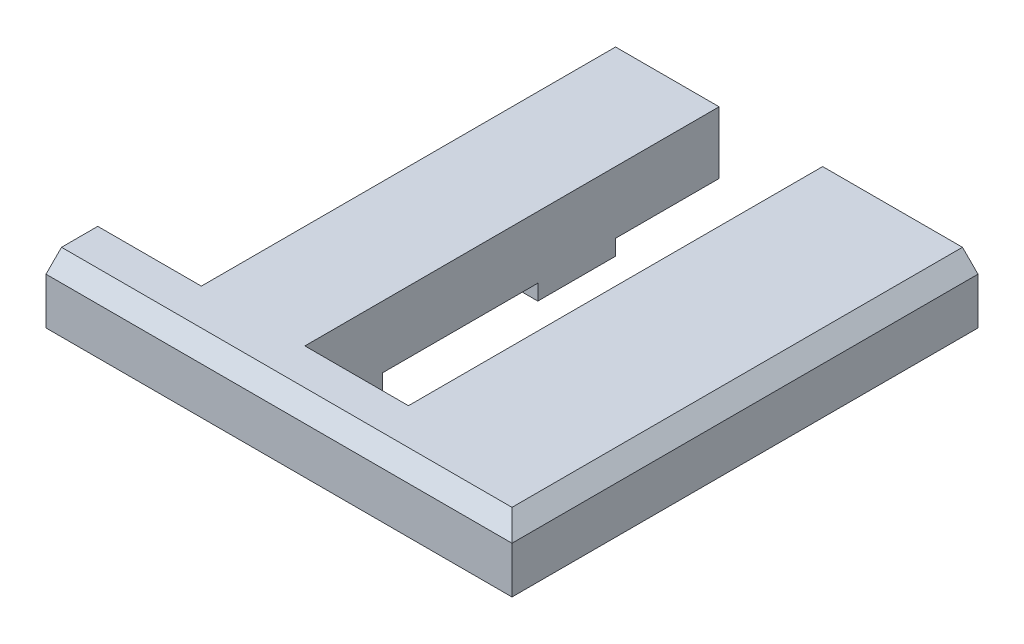
ISO-10303-21;
HEADER;
FILE_DESCRIPTION(('STEP AP214'),'2;1');
FILE_NAME('part.step','',(''),(''),'','','');
FILE_SCHEMA(('AUTOMOTIVE_DESIGN { 1 0 10303 214 1 1 1 1 }'));
ENDSEC;
DATA;
#1=APPLICATION_CONTEXT('core data for automotive mechanical design processes');
#2=APPLICATION_PROTOCOL_DEFINITION('international standard','automotive_design',2000,#1);
#3=PRODUCT_CONTEXT('',#1,'mechanical');
#4=PRODUCT('Part','Part','',(#3));
#5=PRODUCT_RELATED_PRODUCT_CATEGORY('part','',(#4));
#6=PRODUCT_DEFINITION_FORMATION('','',#4);
#7=PRODUCT_DEFINITION_CONTEXT('part definition',#1,'design');
#8=PRODUCT_DEFINITION('design','',#6,#7);
#9=PRODUCT_DEFINITION_SHAPE('','',#8);
#10=(LENGTH_UNIT() NAMED_UNIT(*) SI_UNIT(.MILLI.,.METRE.));
#11=(NAMED_UNIT(*) PLANE_ANGLE_UNIT() SI_UNIT($,.RADIAN.));
#12=(NAMED_UNIT(*) SI_UNIT($,.STERADIAN.) SOLID_ANGLE_UNIT());
#13=UNCERTAINTY_MEASURE_WITH_UNIT(LENGTH_MEASURE(1.E-05),#10,'distance_accuracy_value','');
#14=(GEOMETRIC_REPRESENTATION_CONTEXT(3) GLOBAL_UNCERTAINTY_ASSIGNED_CONTEXT((#13)) GLOBAL_UNIT_ASSIGNED_CONTEXT((#10,
#11,#12)) REPRESENTATION_CONTEXT('',''));
#15=CARTESIAN_POINT('',(0.,0.,0.));
#16=DIRECTION('',(0.,0.,1.));
#17=DIRECTION('',(1.,0.,0.));
#18=AXIS2_PLACEMENT_3D('',#15,#16,#17);
#19=CARTESIAN_POINT('',(0.,0.,0.));
#20=DIRECTION('',(0.,1.,0.));
#21=DIRECTION('',(0.,0.,1.));
#22=AXIS2_PLACEMENT_3D('',#19,#20,#21);
#23=PLANE('',#22);
#24=DIRECTION('',(0.,0.,-1.));
#25=VECTOR('',#24,1.);
#26=CARTESIAN_POINT('',(-127.,0.,0.));
#27=LINE('',#26,#25);
#28=CARTESIAN_POINT('',(-127.,0.,-139.671028997046));
#29=VERTEX_POINT('',#28);
#30=CARTESIAN_POINT('',(-127.,0.,-177.742057994092));
#31=VERTEX_POINT('',#30);
#32=EDGE_CURVE('E347',#29,#31,#27,.T.);
#33=ORIENTED_EDGE('',*,*,#32,.F.);
#34=DIRECTION('',(1.,0.,0.));
#35=VECTOR('',#34,1.);
#36=CARTESIAN_POINT('',(-177.8,0.,-139.671028997046));
#37=LINE('',#36,#35);
#38=CARTESIAN_POINT('',(-177.8,0.,-139.671028997046));
#39=VERTEX_POINT('',#38);
#40=EDGE_CURVE('E244',#39,#29,#37,.T.);
#41=ORIENTED_EDGE('',*,*,#40,.F.);
#42=DIRECTION('',(0.,0.,-1.));
#43=VECTOR('',#42,1.);
#44=CARTESIAN_POINT('',(-177.8,0.,0.));
#45=LINE('',#44,#43);
#46=CARTESIAN_POINT('',(-177.8,0.,-177.742057994092));
#47=VERTEX_POINT('',#46);
#48=EDGE_CURVE('E352',#39,#47,#45,.T.);
#49=ORIENTED_EDGE('',*,*,#48,.T.);
#50=DIRECTION('',(1.,0.,0.));
#51=VECTOR('',#50,1.);
#52=CARTESIAN_POINT('',(0.,0.,-177.742057994092));
#53=LINE('',#52,#51);
#54=EDGE_CURVE('E385',#47,#31,#53,.T.);
#55=ORIENTED_EDGE('',*,*,#54,.T.);
#56=EDGE_LOOP('',(#33,#41,#49,#55));
#57=FACE_BOUND('',#56,.T.);
#58=ADVANCED_FACE('F39',(#57),#23,.F.);
#59=CARTESIAN_POINT('',(0.,38.1,-228.6));
#60=DIRECTION('',(0.,0.,1.));
#61=DIRECTION('',(1.,0.,0.));
#62=AXIS2_PLACEMENT_3D('',#59,#60,#61);
#63=PLANE('',#62);
#64=CARTESIAN_POINT('',(-12.6848921789995,19.05,-228.6));
#65=DIRECTION('',(0.,0.,-1.));
#66=DIRECTION('',(-1.,0.,0.));
#67=AXIS2_PLACEMENT_3D('',#64,#65,#66);
#68=CIRCLE('',#67,9.525);
#69=CARTESIAN_POINT('',(-22.2098921789995,19.05,-228.6));
#70=VERTEX_POINT('',#69);
#71=EDGE_CURVE('E308',#70,#70,#68,.T.);
#72=ORIENTED_EDGE('',*,*,#71,.F.);
#73=EDGE_LOOP('',(#72));
#74=FACE_BOUND('',#73,.T.);
#75=DIRECTION('',(-1.,0.,0.));
#76=VECTOR('',#75,1.);
#77=CARTESIAN_POINT('',(0.,38.1,-228.6));
#78=LINE('',#77,#76);
#79=CARTESIAN_POINT('',(-7.61999999999996,38.1,-228.6));
#80=VERTEX_POINT('',#79);
#81=CARTESIAN_POINT('',(-76.2,38.1,-228.6));
#82=VERTEX_POINT('',#81);
#83=EDGE_CURVE('E321',#80,#82,#78,.T.);
#84=ORIENTED_EDGE('',*,*,#83,.F.);
#85=DIRECTION('',(0.707106781186545,-0.70710678118655,0.));
#86=VECTOR('',#85,1.);
#87=CARTESIAN_POINT('',(-7.61999999999999,38.1,-228.6));
#88=LINE('',#87,#86);
#89=CARTESIAN_POINT('',(0.,30.48,-228.6));
#90=VERTEX_POINT('',#89);
#91=EDGE_CURVE('E411',#80,#90,#88,.T.);
#92=ORIENTED_EDGE('',*,*,#91,.T.);
#93=DIRECTION('',(0.,-1.,0.));
#94=VECTOR('',#93,1.);
#95=CARTESIAN_POINT('',(0.,38.1,-228.6));
#96=LINE('',#95,#94);
#97=CARTESIAN_POINT('',(0.,7.62000000000002,-228.6));
#98=VERTEX_POINT('',#97);
#99=EDGE_CURVE('E339',#90,#98,#96,.T.);
#100=ORIENTED_EDGE('',*,*,#99,.T.);
#101=DIRECTION('',(0.707106781186549,0.707106781186546,0.));
#102=VECTOR('',#101,1.);
#103=CARTESIAN_POINT('',(0.,7.61999999999999,-228.6));
#104=LINE('',#103,#102);
#105=CARTESIAN_POINT('',(-7.62000000000004,0.,-228.6));
#106=VERTEX_POINT('',#105);
#107=EDGE_CURVE('E409',#98,#106,#104,.F.);
#108=ORIENTED_EDGE('',*,*,#107,.T.);
#109=DIRECTION('',(-1.,0.,0.));
#110=VECTOR('',#109,1.);
#111=CARTESIAN_POINT('',(0.,0.,-228.6));
#112=LINE('',#111,#110);
#113=CARTESIAN_POINT('',(-50.8,0.,-228.6));
#114=VERTEX_POINT('',#113);
#115=EDGE_CURVE('E318',#106,#114,#112,.T.);
#116=ORIENTED_EDGE('',*,*,#115,.T.);
#117=DIRECTION('',(0.,1.,0.));
#118=VECTOR('',#117,1.);
#119=CARTESIAN_POINT('',(-50.8,38.1,-228.6));
#120=LINE('',#119,#118);
#121=CARTESIAN_POINT('',(-50.8,7.61999999999987,-228.6));
#122=VERTEX_POINT('',#121);
#123=EDGE_CURVE('E287',#114,#122,#120,.T.);
#124=ORIENTED_EDGE('',*,*,#123,.T.);
#125=DIRECTION('',(-1.,0.,0.));
#126=VECTOR('',#125,1.);
#127=CARTESIAN_POINT('',(0.,7.61999999999986,-228.6));
#128=LINE('',#127,#126);
#129=CARTESIAN_POINT('',(-76.2,7.61999999999988,-228.6));
#130=VERTEX_POINT('',#129);
#131=EDGE_CURVE('E305',#122,#130,#128,.T.);
#132=ORIENTED_EDGE('',*,*,#131,.T.);
#133=DIRECTION('',(0.,-1.,0.));
#134=VECTOR('',#133,1.);
#135=CARTESIAN_POINT('',(-76.2,38.1,-228.6));
#136=LINE('',#135,#134);
#137=EDGE_CURVE('E379',#82,#130,#136,.T.);
#138=ORIENTED_EDGE('',*,*,#137,.F.);
#139=EDGE_LOOP('',(#84,#92,#100,#108,#116,#124,#132,#138));
#140=FACE_BOUND('',#139,.T.);
#141=ADVANCED_FACE('F430',(#74,#140),#63,.F.);
#142=CARTESIAN_POINT('',(-76.2,38.1,0.));
#143=DIRECTION('',(-1.,0.,0.));
#144=DIRECTION('',(0.,0.,1.));
#145=AXIS2_PLACEMENT_3D('',#142,#143,#144);
#146=PLANE('',#145);
#147=DIRECTION('',(0.,-1.,0.));
#148=VECTOR('',#147,1.);
#149=CARTESIAN_POINT('',(-76.2,38.1,-139.671028997046));
#150=LINE('',#149,#148);
#151=CARTESIAN_POINT('',(-76.2,7.62000000000001,-139.671028997046));
#152=VERTEX_POINT('',#151);
#153=CARTESIAN_POINT('',(-76.2,0.,-139.671028997046));
#154=VERTEX_POINT('',#153);
#155=EDGE_CURVE('E268',#152,#154,#150,.T.);
#156=ORIENTED_EDGE('',*,*,#155,.F.);
#157=DIRECTION('',(0.,0.,-1.));
#158=VECTOR('',#157,1.);
#159=CARTESIAN_POINT('',(-76.2,7.62000000000001,0.));
#160=LINE('',#159,#158);
#161=CARTESIAN_POINT('',(-76.2,7.62000000000001,-63.4710289970458));
#162=VERTEX_POINT('',#161);
#163=EDGE_CURVE('E273',#162,#152,#160,.T.);
#164=ORIENTED_EDGE('',*,*,#163,.F.);
#165=DIRECTION('',(0.,1.,0.));
#166=VECTOR('',#165,1.);
#167=CARTESIAN_POINT('',(-76.2,38.1,-63.4710289970458));
#168=LINE('',#167,#166);
#169=CARTESIAN_POINT('',(-76.2,0.,-63.4710289970458));
#170=VERTEX_POINT('',#169);
#171=EDGE_CURVE('E234',#170,#162,#168,.T.);
#172=ORIENTED_EDGE('',*,*,#171,.F.);
#173=DIRECTION('',(0.,0.,-1.));
#174=VECTOR('',#173,1.);
#175=CARTESIAN_POINT('',(-76.2,0.,0.));
#176=LINE('',#175,#174);
#177=CARTESIAN_POINT('',(-76.2,0.,-25.4));
#178=VERTEX_POINT('',#177);
#179=EDGE_CURVE('E342',#178,#170,#176,.T.);
#180=ORIENTED_EDGE('',*,*,#179,.F.);
#181=DIRECTION('',(0.,-1.,0.));
#182=VECTOR('',#181,1.);
#183=CARTESIAN_POINT('',(-76.2,38.1,-25.4));
#184=LINE('',#183,#182);
#185=CARTESIAN_POINT('',(-76.2,38.1,-25.4));
#186=VERTEX_POINT('',#185);
#187=EDGE_CURVE('E377',#186,#178,#184,.T.);
#188=ORIENTED_EDGE('',*,*,#187,.F.);
#189=DIRECTION('',(0.,0.,-1.));
#190=VECTOR('',#189,1.);
#191=CARTESIAN_POINT('',(-76.2,38.1,0.));
#192=LINE('',#191,#190);
#193=EDGE_CURVE('E323',#186,#82,#192,.T.);
#194=ORIENTED_EDGE('',*,*,#193,.T.);
#195=ORIENTED_EDGE('',*,*,#137,.T.);
#196=DIRECTION('',(0.,0.,-1.));
#197=VECTOR('',#196,1.);
#198=CARTESIAN_POINT('',(-76.2,7.62000000000002,0.));
#199=LINE('',#198,#197);
#200=CARTESIAN_POINT('',(-76.2,7.61999999999991,-177.742057994092));
#201=VERTEX_POINT('',#200);
#202=EDGE_CURVE('E303',#201,#130,#199,.T.);
#203=ORIENTED_EDGE('',*,*,#202,.F.);
#204=DIRECTION('',(0.,1.,0.));
#205=VECTOR('',#204,1.);
#206=CARTESIAN_POINT('',(-76.2,38.0999999999999,-177.742057994092));
#207=LINE('',#206,#205);
#208=CARTESIAN_POINT('',(-76.2,0.,-177.742057994092));
#209=VERTEX_POINT('',#208);
#210=EDGE_CURVE('E295',#209,#201,#207,.T.);
#211=ORIENTED_EDGE('',*,*,#210,.F.);
#212=EDGE_CURVE('E341',#154,#209,#176,.T.);
#213=ORIENTED_EDGE('',*,*,#212,.F.);
#214=EDGE_LOOP('',(#156,#164,#172,#180,#188,#194,#195,#203,#211,#213));
#215=FACE_BOUND('',#214,.T.);
#216=ADVANCED_FACE('F447',(#215),#146,.T.);
#217=CARTESIAN_POINT('',(0.,38.1,-25.4));
#218=DIRECTION('',(0.,0.,1.));
#219=DIRECTION('',(1.,0.,0.));
#220=AXIS2_PLACEMENT_3D('',#217,#218,#219);
#221=PLANE('',#220);
#222=DIRECTION('',(-1.,0.,0.));
#223=VECTOR('',#222,1.);
#224=CARTESIAN_POINT('',(0.,0.,-25.4));
#225=LINE('',#224,#223);
#226=CARTESIAN_POINT('',(-127.,0.,-25.4));
#227=VERTEX_POINT('',#226);
#228=EDGE_CURVE('E345',#178,#227,#225,.T.);
#229=ORIENTED_EDGE('',*,*,#228,.T.);
#230=DIRECTION('',(0.,-1.,0.));
#231=VECTOR('',#230,1.);
#232=CARTESIAN_POINT('',(-127.,38.1,-25.4));
#233=LINE('',#232,#231);
#234=CARTESIAN_POINT('',(-127.,38.1,-25.4));
#235=VERTEX_POINT('',#234);
#236=EDGE_CURVE('E374',#235,#227,#233,.T.);
#237=ORIENTED_EDGE('',*,*,#236,.F.);
#238=DIRECTION('',(-1.,0.,0.));
#239=VECTOR('',#238,1.);
#240=CARTESIAN_POINT('',(0.,38.1,-25.4));
#241=LINE('',#240,#239);
#242=EDGE_CURVE('E327',#186,#235,#241,.T.);
#243=ORIENTED_EDGE('',*,*,#242,.F.);
#244=ORIENTED_EDGE('',*,*,#187,.T.);
#245=EDGE_LOOP('',(#229,#237,#243,#244));
#246=FACE_BOUND('',#245,.T.);
#247=ADVANCED_FACE('F490',(#246),#221,.F.);
#248=CARTESIAN_POINT('',(-127.,38.1,0.));
#249=DIRECTION('',(-1.,0.,0.));
#250=DIRECTION('',(0.,0.,1.));
#251=AXIS2_PLACEMENT_3D('',#248,#249,#250);
#252=PLANE('',#251);
#253=DIRECTION('',(0.,0.,-1.));
#254=VECTOR('',#253,1.);
#255=CARTESIAN_POINT('',(-127.,7.62000000000001,0.));
#256=LINE('',#255,#254);
#257=CARTESIAN_POINT('',(-127.,7.62000000000001,-63.4710289970458));
#258=VERTEX_POINT('',#257);
#259=CARTESIAN_POINT('',(-127.,7.62000000000001,-139.671028997046));
#260=VERTEX_POINT('',#259);
#261=EDGE_CURVE('E270',#258,#260,#256,.T.);
#262=ORIENTED_EDGE('',*,*,#261,.T.);
#263=DIRECTION('',(0.,-1.,0.));
#264=VECTOR('',#263,1.);
#265=CARTESIAN_POINT('',(-127.,38.1,-139.671028997046));
#266=LINE('',#265,#264);
#267=EDGE_CURVE('E265',#260,#29,#266,.T.);
#268=ORIENTED_EDGE('',*,*,#267,.T.);
#269=ORIENTED_EDGE('',*,*,#32,.T.);
#270=DIRECTION('',(0.,1.,0.));
#271=VECTOR('',#270,1.);
#272=CARTESIAN_POINT('',(-127.,38.0999999999999,-177.742057994092));
#273=LINE('',#272,#271);
#274=CARTESIAN_POINT('',(-127.,7.61999999999992,-177.742057994092));
#275=VERTEX_POINT('',#274);
#276=EDGE_CURVE('E292',#31,#275,#273,.T.);
#277=ORIENTED_EDGE('',*,*,#276,.T.);
#278=DIRECTION('',(0.,0.,-1.));
#279=VECTOR('',#278,1.);
#280=CARTESIAN_POINT('',(-127.,7.62000000000003,0.));
#281=LINE('',#280,#279);
#282=CARTESIAN_POINT('',(-127.,7.61999999999989,-228.6));
#283=VERTEX_POINT('',#282);
#284=EDGE_CURVE('E300',#275,#283,#281,.T.);
#285=ORIENTED_EDGE('',*,*,#284,.T.);
#286=DIRECTION('',(0.,-1.,0.));
#287=VECTOR('',#286,1.);
#288=CARTESIAN_POINT('',(-127.,38.1,-228.6));
#289=LINE('',#288,#287);
#290=CARTESIAN_POINT('',(-127.,38.1,-228.6));
#291=VERTEX_POINT('',#290);
#292=EDGE_CURVE('E371',#291,#283,#289,.T.);
#293=ORIENTED_EDGE('',*,*,#292,.F.);
#294=DIRECTION('',(0.,0.,-1.));
#295=VECTOR('',#294,1.);
#296=CARTESIAN_POINT('',(-127.,38.1,0.));
#297=LINE('',#296,#295);
#298=EDGE_CURVE('E329',#235,#291,#297,.T.);
#299=ORIENTED_EDGE('',*,*,#298,.F.);
#300=ORIENTED_EDGE('',*,*,#236,.T.);
#301=CARTESIAN_POINT('',(-127.,0.,-63.4710289970458));
#302=VERTEX_POINT('',#301);
#303=EDGE_CURVE('E349',#227,#302,#27,.T.);
#304=ORIENTED_EDGE('',*,*,#303,.T.);
#305=DIRECTION('',(0.,1.,0.));
#306=VECTOR('',#305,1.);
#307=CARTESIAN_POINT('',(-127.,38.1,-63.4710289970458));
#308=LINE('',#307,#306);
#309=EDGE_CURVE('E257',#302,#258,#308,.T.);
#310=ORIENTED_EDGE('',*,*,#309,.T.);
#311=EDGE_LOOP('',(#262,#268,#269,#277,#285,#293,#299,#300,#304,#310));
#312=FACE_BOUND('',#311,.T.);
#313=ADVANCED_FACE('F484',(#312),#252,.F.);
#314=CARTESIAN_POINT('',(0.,38.1,-228.6));
#315=DIRECTION('',(0.,0.,1.));
#316=DIRECTION('',(1.,0.,0.));
#317=AXIS2_PLACEMENT_3D('',#314,#315,#316);
#318=PLANE('',#317);
#319=ORIENTED_EDGE('',*,*,#292,.T.);
#320=DIRECTION('',(-1.,0.,0.));
#321=VECTOR('',#320,1.);
#322=CARTESIAN_POINT('',(0.,7.61999999999986,-228.6));
#323=LINE('',#322,#321);
#324=CARTESIAN_POINT('',(-177.8,7.6199999999999,-228.6));
#325=VERTEX_POINT('',#324);
#326=EDGE_CURVE('E297',#283,#325,#323,.T.);
#327=ORIENTED_EDGE('',*,*,#326,.T.);
#328=DIRECTION('',(0.,-1.,0.));
#329=VECTOR('',#328,1.);
#330=CARTESIAN_POINT('',(-177.8,38.1,-228.6));
#331=LINE('',#330,#329);
#332=CARTESIAN_POINT('',(-177.8,38.1,-228.6));
#333=VERTEX_POINT('',#332);
#334=EDGE_CURVE('E368',#333,#325,#331,.T.);
#335=ORIENTED_EDGE('',*,*,#334,.F.);
#336=DIRECTION('',(-1.,0.,0.));
#337=VECTOR('',#336,1.);
#338=CARTESIAN_POINT('',(0.,38.1,-228.6));
#339=LINE('',#338,#337);
#340=EDGE_CURVE('E332',#291,#333,#339,.T.);
#341=ORIENTED_EDGE('',*,*,#340,.F.);
#342=EDGE_LOOP('',(#319,#327,#335,#341));
#343=FACE_BOUND('',#342,.T.);
#344=ADVANCED_FACE('F568',(#343),#318,.F.);
#345=CARTESIAN_POINT('',(-177.8,38.1,0.));
#346=DIRECTION('',(-1.,0.,0.));
#347=DIRECTION('',(0.,0.,1.));
#348=AXIS2_PLACEMENT_3D('',#345,#346,#347);
#349=PLANE('',#348);
#350=DIRECTION('',(0.,-1.,0.));
#351=VECTOR('',#350,1.);
#352=CARTESIAN_POINT('',(-177.8,7.62000000000001,-139.671028997046));
#353=LINE('',#352,#351);
#354=CARTESIAN_POINT('',(-177.8,7.62000000000001,-139.671028997046));
#355=VERTEX_POINT('',#354);
#356=EDGE_CURVE('E258',#355,#39,#353,.T.);
#357=ORIENTED_EDGE('',*,*,#356,.F.);
#358=DIRECTION('',(0.,0.,-1.));
#359=VECTOR('',#358,1.);
#360=CARTESIAN_POINT('',(-177.8,7.62000000000001,-63.4710289970458));
#361=LINE('',#360,#359);
#362=CARTESIAN_POINT('',(-177.8,7.62000000000001,-63.4710289970458));
#363=VERTEX_POINT('',#362);
#364=EDGE_CURVE('E237',#363,#355,#361,.T.);
#365=ORIENTED_EDGE('',*,*,#364,.F.);
#366=DIRECTION('',(0.,-1.,0.));
#367=VECTOR('',#366,1.);
#368=CARTESIAN_POINT('',(-177.8,7.62000000000001,-63.4710289970458));
#369=LINE('',#368,#367);
#370=CARTESIAN_POINT('',(-177.8,0.,-63.4710289970458));
#371=VERTEX_POINT('',#370);
#372=EDGE_CURVE('E227',#363,#371,#369,.T.);
#373=ORIENTED_EDGE('',*,*,#372,.T.);
#374=CARTESIAN_POINT('',(-177.8,0.,-25.4));
#375=VERTEX_POINT('',#374);
#376=EDGE_CURVE('E353',#375,#371,#45,.T.);
#377=ORIENTED_EDGE('',*,*,#376,.F.);
#378=DIRECTION('',(0.,-1.,0.));
#379=VECTOR('',#378,1.);
#380=CARTESIAN_POINT('',(-177.8,38.1,-25.4));
#381=LINE('',#380,#379);
#382=CARTESIAN_POINT('',(-177.8,38.1,-25.4));
#383=VERTEX_POINT('',#382);
#384=EDGE_CURVE('E366',#383,#375,#381,.T.);
#385=ORIENTED_EDGE('',*,*,#384,.F.);
#386=DIRECTION('',(0.,0.,-1.));
#387=VECTOR('',#386,1.);
#388=CARTESIAN_POINT('',(-177.8,38.1,0.));
#389=LINE('',#388,#387);
#390=EDGE_CURVE('E334',#383,#333,#389,.T.);
#391=ORIENTED_EDGE('',*,*,#390,.T.);
#392=ORIENTED_EDGE('',*,*,#334,.T.);
#393=DIRECTION('',(0.,0.,-1.));
#394=VECTOR('',#393,1.);
#395=CARTESIAN_POINT('',(-177.8,7.62000000000004,0.));
#396=LINE('',#395,#394);
#397=CARTESIAN_POINT('',(-177.8,7.61999999999993,-177.742057994092));
#398=VERTEX_POINT('',#397);
#399=EDGE_CURVE('E388',#398,#325,#396,.T.);
#400=ORIENTED_EDGE('',*,*,#399,.F.);
#401=DIRECTION('',(0.,1.,0.));
#402=VECTOR('',#401,1.);
#403=CARTESIAN_POINT('',(-177.8,38.0999999999999,-177.742057994092));
#404=LINE('',#403,#402);
#405=EDGE_CURVE('E290',#47,#398,#404,.T.);
#406=ORIENTED_EDGE('',*,*,#405,.F.);
#407=ORIENTED_EDGE('',*,*,#48,.F.);
#408=EDGE_LOOP('',(#357,#365,#373,#377,#385,#391,#392,#400,#406,#407));
#409=FACE_BOUND('',#408,.T.);
#410=ADVANCED_FACE('F477',(#409),#349,.T.);
#411=CARTESIAN_POINT('',(-228.6,0.,-25.4));
#412=VERTEX_POINT('',#411);
#413=EDGE_CURVE('E348',#375,#412,#225,.T.);
#414=ORIENTED_EDGE('',*,*,#413,.T.);
#415=DIRECTION('',(0.,-1.,0.));
#416=VECTOR('',#415,1.);
#417=CARTESIAN_POINT('',(-228.6,38.1,-25.4));
#418=LINE('',#417,#416);
#419=CARTESIAN_POINT('',(-228.6,38.1,-25.4));
#420=VERTEX_POINT('',#419);
#421=EDGE_CURVE('E363',#420,#412,#418,.T.);
#422=ORIENTED_EDGE('',*,*,#421,.F.);
#423=EDGE_CURVE('E330',#383,#420,#241,.T.);
#424=ORIENTED_EDGE('',*,*,#423,.F.);
#425=ORIENTED_EDGE('',*,*,#384,.T.);
#426=EDGE_LOOP('',(#414,#422,#424,#425));
#427=FACE_BOUND('',#426,.T.);
#428=ADVANCED_FACE('F473',(#427),#221,.F.);
#429=CARTESIAN_POINT('',(-228.6,38.1,0.));
#430=DIRECTION('',(-1.,0.,0.));
#431=DIRECTION('',(0.,0.,1.));
#432=AXIS2_PLACEMENT_3D('',#429,#430,#431);
#433=PLANE('',#432);
#434=CARTESIAN_POINT('',(-228.6,19.05,-12.7));
#435=DIRECTION('',(-1.,0.,0.));
#436=DIRECTION('',(0.,0.,1.));
#437=AXIS2_PLACEMENT_3D('',#434,#435,#436);
#438=CIRCLE('',#437,9.525);
#439=CARTESIAN_POINT('',(-228.6,19.05,-3.175));
#440=VERTEX_POINT('',#439);
#441=EDGE_CURVE('E312',#440,#440,#438,.T.);
#442=ORIENTED_EDGE('',*,*,#441,.F.);
#443=EDGE_LOOP('',(#442));
#444=FACE_BOUND('',#443,.T.);
#445=DIRECTION('',(0.,-1.,0.));
#446=VECTOR('',#445,1.);
#447=CARTESIAN_POINT('',(-228.6,38.1,0.));
#448=LINE('',#447,#446);
#449=CARTESIAN_POINT('',(-228.6,30.48,0.));
#450=VERTEX_POINT('',#449);
#451=CARTESIAN_POINT('',(-228.6,7.62000000000002,0.));
#452=VERTEX_POINT('',#451);
#453=EDGE_CURVE('E360',#450,#452,#448,.T.);
#454=ORIENTED_EDGE('',*,*,#453,.F.);
#455=DIRECTION('',(0.,-0.70710678118655,0.707106781186545));
#456=VECTOR('',#455,1.);
#457=CARTESIAN_POINT('',(-228.6,34.29,-3.81000000000001));
#458=LINE('',#457,#456);
#459=CARTESIAN_POINT('',(-228.6,38.1,-7.61999999999996));
#460=VERTEX_POINT('',#459);
#461=EDGE_CURVE('E403',#450,#460,#458,.F.);
#462=ORIENTED_EDGE('',*,*,#461,.T.);
#463=DIRECTION('',(0.,0.,-1.));
#464=VECTOR('',#463,1.);
#465=CARTESIAN_POINT('',(-228.6,38.1,0.));
#466=LINE('',#465,#464);
#467=EDGE_CURVE('E337',#460,#420,#466,.T.);
#468=ORIENTED_EDGE('',*,*,#467,.T.);
#469=ORIENTED_EDGE('',*,*,#421,.T.);
#470=DIRECTION('',(0.,0.,-1.));
#471=VECTOR('',#470,1.);
#472=CARTESIAN_POINT('',(-228.6,0.,0.));
#473=LINE('',#472,#471);
#474=CARTESIAN_POINT('',(-228.6,0.,-7.62000000000004));
#475=VERTEX_POINT('',#474);
#476=EDGE_CURVE('E324',#475,#412,#473,.T.);
#477=ORIENTED_EDGE('',*,*,#476,.F.);
#478=DIRECTION('',(0.,0.707106781186546,0.707106781186549));
#479=VECTOR('',#478,1.);
#480=CARTESIAN_POINT('',(-228.6,22.86,15.24));
#481=LINE('',#480,#479);
#482=EDGE_CURVE('E401',#475,#452,#481,.T.);
#483=ORIENTED_EDGE('',*,*,#482,.T.);
#484=EDGE_LOOP('',(#454,#462,#468,#469,#477,#483));
#485=FACE_BOUND('',#484,.T.);
#486=ADVANCED_FACE('F463',(#444,#485),#433,.T.);
#487=CARTESIAN_POINT('',(0.,38.1,0.));
#488=DIRECTION('',(0.,0.,1.));
#489=DIRECTION('',(1.,0.,0.));
#490=AXIS2_PLACEMENT_3D('',#487,#488,#489);
#491=PLANE('',#490);
#492=DIRECTION('',(0.,-1.,0.));
#493=VECTOR('',#492,1.);
#494=CARTESIAN_POINT('',(0.,38.1,0.));
#495=LINE('',#494,#493);
#496=CARTESIAN_POINT('',(0.,30.48,0.));
#497=VERTEX_POINT('',#496);
#498=CARTESIAN_POINT('',(0.,7.62000000000002,0.));
#499=VERTEX_POINT('',#498);
#500=EDGE_CURVE('E358',#497,#499,#495,.T.);
#501=ORIENTED_EDGE('',*,*,#500,.F.);
#502=DIRECTION('',(-1.,0.,0.));
#503=VECTOR('',#502,1.);
#504=CARTESIAN_POINT('',(0.,30.48,0.));
#505=LINE('',#504,#503);
#506=EDGE_CURVE('E398',#497,#450,#505,.T.);
#507=ORIENTED_EDGE('',*,*,#506,.T.);
#508=ORIENTED_EDGE('',*,*,#453,.T.);
#509=DIRECTION('',(1.,0.,0.));
#510=VECTOR('',#509,1.);
#511=CARTESIAN_POINT('',(0.,7.62000000000002,0.));
#512=LINE('',#511,#510);
#513=EDGE_CURVE('E394',#452,#499,#512,.T.);
#514=ORIENTED_EDGE('',*,*,#513,.T.);
#515=EDGE_LOOP('',(#501,#507,#508,#514));
#516=FACE_BOUND('',#515,.T.);
#517=ADVANCED_FACE('F460',(#516),#491,.T.);
#518=CARTESIAN_POINT('',(0.,38.1,0.));
#519=DIRECTION('',(-1.,0.,0.));
#520=DIRECTION('',(0.,0.,1.));
#521=AXIS2_PLACEMENT_3D('',#518,#519,#520);
#522=PLANE('',#521);
#523=ORIENTED_EDGE('',*,*,#99,.F.);
#524=DIRECTION('',(0.,0.,1.));
#525=VECTOR('',#524,1.);
#526=CARTESIAN_POINT('',(0.,30.48,0.));
#527=LINE('',#526,#525);
#528=EDGE_CURVE('E414',#90,#497,#527,.T.);
#529=ORIENTED_EDGE('',*,*,#528,.T.);
#530=ORIENTED_EDGE('',*,*,#500,.T.);
#531=DIRECTION('',(0.,0.,-1.));
#532=VECTOR('',#531,1.);
#533=CARTESIAN_POINT('',(0.,7.62000000000002,0.));
#534=LINE('',#533,#532);
#535=EDGE_CURVE('E63',#499,#98,#534,.T.);
#536=ORIENTED_EDGE('',*,*,#535,.T.);
#537=EDGE_LOOP('',(#523,#529,#530,#536));
#538=FACE_BOUND('',#537,.T.);
#539=ADVANCED_FACE('F458',(#538),#522,.F.);
#540=CARTESIAN_POINT('',(0.,38.1,0.));
#541=DIRECTION('',(0.,1.,0.));
#542=DIRECTION('',(0.,0.,1.));
#543=AXIS2_PLACEMENT_3D('',#540,#541,#542);
#544=PLANE('',#543);
#545=ORIENTED_EDGE('',*,*,#467,.F.);
#546=DIRECTION('',(1.,0.,0.));
#547=VECTOR('',#546,1.);
#548=CARTESIAN_POINT('',(0.,38.1,-7.61999999999996));
#549=LINE('',#548,#547);
#550=CARTESIAN_POINT('',(-7.61999999999996,38.1,-7.61999999999996));
#551=VERTEX_POINT('',#550);
#552=EDGE_CURVE('E407',#460,#551,#549,.T.);
#553=ORIENTED_EDGE('',*,*,#552,.T.);
#554=DIRECTION('',(0.,0.,-1.));
#555=VECTOR('',#554,1.);
#556=CARTESIAN_POINT('',(-7.61999999999996,38.1,-228.6));
#557=LINE('',#556,#555);
#558=EDGE_CURVE('E405',#551,#80,#557,.T.);
#559=ORIENTED_EDGE('',*,*,#558,.T.);
#560=ORIENTED_EDGE('',*,*,#83,.T.);
#561=ORIENTED_EDGE('',*,*,#193,.F.);
#562=ORIENTED_EDGE('',*,*,#242,.T.);
#563=ORIENTED_EDGE('',*,*,#298,.T.);
#564=ORIENTED_EDGE('',*,*,#340,.T.);
#565=ORIENTED_EDGE('',*,*,#390,.F.);
#566=ORIENTED_EDGE('',*,*,#423,.T.);
#567=EDGE_LOOP('',(#545,#553,#559,#560,#561,#562,#563,#564,#565,#566));
#568=FACE_BOUND('',#567,.T.);
#569=ADVANCED_FACE('F522',(#568),#544,.T.);
#570=DIRECTION('',(0.,0.,1.));
#571=VECTOR('',#570,1.);
#572=CARTESIAN_POINT('',(-7.62000000000004,0.,0.));
#573=LINE('',#572,#571);
#574=CARTESIAN_POINT('',(-7.62000000000004,0.,-7.62000000000004));
#575=VERTEX_POINT('',#574);
#576=EDGE_CURVE('E49',#106,#575,#573,.T.);
#577=ORIENTED_EDGE('',*,*,#576,.T.);
#578=DIRECTION('',(-1.,0.,0.));
#579=VECTOR('',#578,1.);
#580=CARTESIAN_POINT('',(-228.6,0.,-7.62000000000004));
#581=LINE('',#580,#579);
#582=EDGE_CURVE('E11',#575,#475,#581,.T.);
#583=ORIENTED_EDGE('',*,*,#582,.T.);
#584=ORIENTED_EDGE('',*,*,#476,.T.);
#585=ORIENTED_EDGE('',*,*,#413,.F.);
#586=ORIENTED_EDGE('',*,*,#376,.T.);
#587=DIRECTION('',(1.,0.,0.));
#588=VECTOR('',#587,1.);
#589=CARTESIAN_POINT('',(0.,0.,-63.4710289970458));
#590=LINE('',#589,#588);
#591=EDGE_CURVE('E391',#371,#302,#590,.T.);
#592=ORIENTED_EDGE('',*,*,#591,.T.);
#593=ORIENTED_EDGE('',*,*,#303,.F.);
#594=ORIENTED_EDGE('',*,*,#228,.F.);
#595=ORIENTED_EDGE('',*,*,#179,.T.);
#596=DIRECTION('',(-1.,0.,0.));
#597=VECTOR('',#596,1.);
#598=CARTESIAN_POINT('',(-177.8,0.,-63.4710289970458));
#599=LINE('',#598,#597);
#600=CARTESIAN_POINT('',(-50.8,0.,-63.4710289970458));
#601=VERTEX_POINT('',#600);
#602=EDGE_CURVE('E246',#601,#170,#599,.T.);
#603=ORIENTED_EDGE('',*,*,#602,.F.);
#604=DIRECTION('',(0.,0.,1.));
#605=VECTOR('',#604,1.);
#606=CARTESIAN_POINT('',(-50.8,0.,-139.671028997046));
#607=LINE('',#606,#605);
#608=CARTESIAN_POINT('',(-50.8,0.,-139.671028997046));
#609=VERTEX_POINT('',#608);
#610=EDGE_CURVE('E224',#609,#601,#607,.T.);
#611=ORIENTED_EDGE('',*,*,#610,.F.);
#612=DIRECTION('',(-1.,0.,0.));
#613=VECTOR('',#612,1.);
#614=CARTESIAN_POINT('',(0.,0.,-139.671028997046));
#615=LINE('',#614,#613);
#616=EDGE_CURVE('E390',#609,#154,#615,.T.);
#617=ORIENTED_EDGE('',*,*,#616,.T.);
#618=ORIENTED_EDGE('',*,*,#212,.T.);
#619=DIRECTION('',(-1.,0.,0.));
#620=VECTOR('',#619,1.);
#621=CARTESIAN_POINT('',(-279.4,0.,-177.742057994092));
#622=LINE('',#621,#620);
#623=CARTESIAN_POINT('',(-50.8,-1.00050594689128E-13,-177.742057994092));
#624=VERTEX_POINT('',#623);
#625=EDGE_CURVE('E275',#624,#209,#622,.T.);
#626=ORIENTED_EDGE('',*,*,#625,.F.);
#627=DIRECTION('',(0.,0.,-1.));
#628=VECTOR('',#627,1.);
#629=CARTESIAN_POINT('',(-50.8000000000001,0.,0.));
#630=LINE('',#629,#628);
#631=EDGE_CURVE('E382',#624,#114,#630,.T.);
#632=ORIENTED_EDGE('',*,*,#631,.T.);
#633=ORIENTED_EDGE('',*,*,#115,.F.);
#634=EDGE_LOOP('',(#577,#583,#584,#585,#586,#592,#593,#594,#595,#603,#611,#617,#618,#626,#632,#633));
#635=FACE_BOUND('',#634,.T.);
#636=ADVANCED_FACE('F432',(#635),#23,.F.);
#637=CARTESIAN_POINT('',(-190.5,19.05,-12.7));
#638=DIRECTION('',(-1.,0.,0.));
#639=DIRECTION('',(0.,0.,1.));
#640=AXIS2_PLACEMENT_3D('',#637,#638,#639);
#641=CYLINDRICAL_SURFACE('',#640,9.525);
#642=CARTESIAN_POINT('',(-190.5,19.05,-12.7));
#643=DIRECTION('',(-1.,0.,0.));
#644=DIRECTION('',(0.,0.,1.));
#645=AXIS2_PLACEMENT_3D('',#642,#643,#644);
#646=CIRCLE('',#645,9.525);
#647=CARTESIAN_POINT('',(-190.5,19.05,-3.175));
#648=VERTEX_POINT('',#647);
#649=EDGE_CURVE('E315',#648,#648,#646,.T.);
#650=CARTESIAN_POINT('',(-190.5,19.05,-3.175));
#651=CARTESIAN_POINT('',(-190.896875,19.05,-3.175));
#652=CARTESIAN_POINT('',(-191.29375,19.05,-3.175));
#653=CARTESIAN_POINT('',(-192.0875,19.05,-3.175));
#654=CARTESIAN_POINT('',(-192.484375,19.05,-3.175));
#655=CARTESIAN_POINT('',(-193.278125,19.05,-3.175));
#656=CARTESIAN_POINT('',(-193.675,19.05,-3.175));
#657=CARTESIAN_POINT('',(-194.46875,19.05,-3.175));
#658=CARTESIAN_POINT('',(-194.865625,19.05,-3.175));
#659=CARTESIAN_POINT('',(-195.659375,19.05,-3.175));
#660=CARTESIAN_POINT('',(-196.05625,19.05,-3.175));
#661=CARTESIAN_POINT('',(-196.85,19.05,-3.175));
#662=CARTESIAN_POINT('',(-197.246875,19.05,-3.175));
#663=CARTESIAN_POINT('',(-198.040625,19.05,-3.175));
#664=CARTESIAN_POINT('',(-198.4375,19.05,-3.175));
#665=CARTESIAN_POINT('',(-199.23125,19.05,-3.175));
#666=CARTESIAN_POINT('',(-199.628125,19.05,-3.175));
#667=CARTESIAN_POINT('',(-200.421875,19.05,-3.175));
#668=CARTESIAN_POINT('',(-200.81875,19.05,-3.175));
#669=CARTESIAN_POINT('',(-201.6125,19.05,-3.175));
#670=CARTESIAN_POINT('',(-202.009375,19.05,-3.175));
#671=CARTESIAN_POINT('',(-202.803125,19.05,-3.175));
#672=CARTESIAN_POINT('',(-203.2,19.05,-3.175));
#673=CARTESIAN_POINT('',(-203.99375,19.05,-3.175));
#674=CARTESIAN_POINT('',(-204.390625,19.05,-3.175));
#675=CARTESIAN_POINT('',(-205.184375,19.05,-3.175));
#676=CARTESIAN_POINT('',(-205.58125,19.05,-3.175));
#677=CARTESIAN_POINT('',(-206.375,19.05,-3.175));
#678=CARTESIAN_POINT('',(-206.771875,19.05,-3.175));
#679=CARTESIAN_POINT('',(-207.565625,19.05,-3.175));
#680=CARTESIAN_POINT('',(-207.9625,19.05,-3.175));
#681=CARTESIAN_POINT('',(-208.75625,19.05,-3.175));
#682=CARTESIAN_POINT('',(-209.153125,19.05,-3.175));
#683=CARTESIAN_POINT('',(-209.946875,19.05,-3.175));
#684=CARTESIAN_POINT('',(-210.34375,19.05,-3.175));
#685=CARTESIAN_POINT('',(-211.1375,19.05,-3.175));
#686=CARTESIAN_POINT('',(-211.534375,19.05,-3.175));
#687=CARTESIAN_POINT('',(-212.328125,19.05,-3.175));
#688=CARTESIAN_POINT('',(-212.725,19.05,-3.175));
#689=CARTESIAN_POINT('',(-213.51875,19.05,-3.175));
#690=CARTESIAN_POINT('',(-213.915625,19.05,-3.175));
#691=CARTESIAN_POINT('',(-214.709375,19.05,-3.175));
#692=CARTESIAN_POINT('',(-215.10625,19.05,-3.175));
#693=CARTESIAN_POINT('',(-215.9,19.05,-3.175));
#694=CARTESIAN_POINT('',(-216.296875,19.05,-3.175));
#695=CARTESIAN_POINT('',(-217.090625,19.05,-3.175));
#696=CARTESIAN_POINT('',(-217.4875,19.05,-3.175));
#697=CARTESIAN_POINT('',(-218.28125,19.05,-3.175));
#698=CARTESIAN_POINT('',(-218.678125,19.05,-3.175));
#699=CARTESIAN_POINT('',(-219.471875,19.05,-3.175));
#700=CARTESIAN_POINT('',(-219.86875,19.05,-3.175));
#701=CARTESIAN_POINT('',(-220.6625,19.05,-3.175));
#702=CARTESIAN_POINT('',(-221.059375,19.05,-3.175));
#703=CARTESIAN_POINT('',(-221.853125,19.05,-3.175));
#704=CARTESIAN_POINT('',(-222.25,19.05,-3.175));
#705=CARTESIAN_POINT('',(-223.04375,19.05,-3.175));
#706=CARTESIAN_POINT('',(-223.440625,19.05,-3.175));
#707=CARTESIAN_POINT('',(-224.234375,19.05,-3.175));
#708=CARTESIAN_POINT('',(-224.63125,19.05,-3.175));
#709=CARTESIAN_POINT('',(-225.425,19.05,-3.175));
#710=CARTESIAN_POINT('',(-225.821875,19.05,-3.175));
#711=CARTESIAN_POINT('',(-226.615625,19.05,-3.175));
#712=CARTESIAN_POINT('',(-227.0125,19.05,-3.175));
#713=CARTESIAN_POINT('',(-227.80625,19.05,-3.175));
#714=CARTESIAN_POINT('',(-228.203125,19.05,-3.175));
#715=CARTESIAN_POINT('',(-228.6,19.05,-3.175));
#716=B_SPLINE_CURVE_WITH_KNOTS('',3,(#650,#651,#652,#653,#654,#655,#656,#657,#658,#659,#660,
#661,#662,#663,#664,#665,#666,#667,#668,#669,#670,#671,#672,#673,#674,#675,#676,#677,#678,#679,
#680,#681,#682,#683,#684,#685,#686,#687,#688,#689,#690,#691,#692,#693,#694,#695,#696,#697,#698,
#699,#700,#701,#702,#703,#704,#705,#706,#707,#708,#709,#710,#711,#712,#713,#714,#715),
.UNSPECIFIED.,.F.,.F.,(4,2,2,2,2,2,2,2,2,2,2,2,2,2,2,2,2,2,2,2,2,2,2,2,2,2,2,2,2,2,2,2,4),(0.,
1.190625,2.38125,3.571875,4.7625,5.953125,7.14375,8.334375,9.52500000000001,10.715625,11.90625,
13.096875,14.2875,15.478125,16.66875,17.859375,19.05,20.240625,21.43125,22.621875,23.8125,
25.003125,26.19375,27.384375,28.575,29.765625,30.95625,32.146875,33.3375,34.528125,35.71875,
36.909375,38.1),.UNSPECIFIED.);
#717=EDGE_CURVE('BSEAM521',#648,#440,#716,.T.);
#718=ORIENTED_EDGE('',*,*,#649,.F.);
#719=ORIENTED_EDGE('',*,*,#441,.T.);
#720=ORIENTED_EDGE('',*,*,#717,.T.);
#721=ORIENTED_EDGE('',*,*,#717,.F.);
#722=EDGE_LOOP('',(#718,#720,#719,#721));
#723=FACE_BOUND('',#722,.T.);
#724=ADVANCED_FACE('F521',(#723),#641,.F.);
#725=CARTESIAN_POINT('',(-190.5,19.05,-12.7));
#726=DIRECTION('',(-1.,0.,0.));
#727=DIRECTION('',(0.,0.,1.));
#728=AXIS2_PLACEMENT_3D('',#725,#726,#727);
#729=PLANE('',#728);
#730=ORIENTED_EDGE('',*,*,#649,.T.);
#731=EDGE_LOOP('',(#730));
#732=FACE_BOUND('',#731,.T.);
#733=ADVANCED_FACE('F527',(#732),#729,.T.);
#734=CARTESIAN_POINT('',(-12.6848921789995,19.05,-190.5));
#735=DIRECTION('',(0.,0.,-1.));
#736=DIRECTION('',(-1.,0.,0.));
#737=AXIS2_PLACEMENT_3D('',#734,#735,#736);
#738=CYLINDRICAL_SURFACE('',#737,9.525);
#739=CARTESIAN_POINT('',(-12.6848921789995,19.05,-190.5));
#740=DIRECTION('',(0.,0.,-1.));
#741=DIRECTION('',(-1.,0.,0.));
#742=AXIS2_PLACEMENT_3D('',#739,#740,#741);
#743=CIRCLE('',#742,9.525);
#744=CARTESIAN_POINT('',(-22.2098921789995,19.05,-190.5));
#745=VERTEX_POINT('',#744);
#746=EDGE_CURVE('E309',#745,#745,#743,.T.);
#747=CARTESIAN_POINT('',(-22.2098921789995,19.05,-190.5));
#748=CARTESIAN_POINT('',(-22.2098921789995,19.05,-190.896875));
#749=CARTESIAN_POINT('',(-22.2098921789995,19.05,-191.29375));
#750=CARTESIAN_POINT('',(-22.2098921789995,19.05,-192.0875));
#751=CARTESIAN_POINT('',(-22.2098921789995,19.05,-192.484375));
#752=CARTESIAN_POINT('',(-22.2098921789995,19.05,-193.278125));
#753=CARTESIAN_POINT('',(-22.2098921789995,19.05,-193.675));
#754=CARTESIAN_POINT('',(-22.2098921789995,19.05,-194.46875));
#755=CARTESIAN_POINT('',(-22.2098921789995,19.05,-194.865625));
#756=CARTESIAN_POINT('',(-22.2098921789995,19.05,-195.659375));
#757=CARTESIAN_POINT('',(-22.2098921789995,19.05,-196.05625));
#758=CARTESIAN_POINT('',(-22.2098921789995,19.05,-196.85));
#759=CARTESIAN_POINT('',(-22.2098921789995,19.05,-197.246875));
#760=CARTESIAN_POINT('',(-22.2098921789995,19.05,-198.040625));
#761=CARTESIAN_POINT('',(-22.2098921789995,19.05,-198.4375));
#762=CARTESIAN_POINT('',(-22.2098921789995,19.05,-199.23125));
#763=CARTESIAN_POINT('',(-22.2098921789995,19.05,-199.628125));
#764=CARTESIAN_POINT('',(-22.2098921789995,19.05,-200.421875));
#765=CARTESIAN_POINT('',(-22.2098921789995,19.05,-200.81875));
#766=CARTESIAN_POINT('',(-22.2098921789995,19.05,-201.6125));
#767=CARTESIAN_POINT('',(-22.2098921789995,19.05,-202.009375));
#768=CARTESIAN_POINT('',(-22.2098921789995,19.05,-202.803125));
#769=CARTESIAN_POINT('',(-22.2098921789995,19.05,-203.2));
#770=CARTESIAN_POINT('',(-22.2098921789995,19.05,-203.99375));
#771=CARTESIAN_POINT('',(-22.2098921789995,19.05,-204.390625));
#772=CARTESIAN_POINT('',(-22.2098921789995,19.05,-205.184375));
#773=CARTESIAN_POINT('',(-22.2098921789995,19.05,-205.58125));
#774=CARTESIAN_POINT('',(-22.2098921789995,19.05,-206.375));
#775=CARTESIAN_POINT('',(-22.2098921789995,19.05,-206.771875));
#776=CARTESIAN_POINT('',(-22.2098921789995,19.05,-207.565625));
#777=CARTESIAN_POINT('',(-22.2098921789995,19.05,-207.9625));
#778=CARTESIAN_POINT('',(-22.2098921789995,19.05,-208.75625));
#779=CARTESIAN_POINT('',(-22.2098921789995,19.05,-209.153125));
#780=CARTESIAN_POINT('',(-22.2098921789995,19.05,-209.946875));
#781=CARTESIAN_POINT('',(-22.2098921789995,19.05,-210.34375));
#782=CARTESIAN_POINT('',(-22.2098921789995,19.05,-211.1375));
#783=CARTESIAN_POINT('',(-22.2098921789995,19.05,-211.534375));
#784=CARTESIAN_POINT('',(-22.2098921789995,19.05,-212.328125));
#785=CARTESIAN_POINT('',(-22.2098921789995,19.05,-212.725));
#786=CARTESIAN_POINT('',(-22.2098921789995,19.05,-213.51875));
#787=CARTESIAN_POINT('',(-22.2098921789995,19.05,-213.915625));
#788=CARTESIAN_POINT('',(-22.2098921789995,19.05,-214.709375));
#789=CARTESIAN_POINT('',(-22.2098921789995,19.05,-215.10625));
#790=CARTESIAN_POINT('',(-22.2098921789995,19.05,-215.9));
#791=CARTESIAN_POINT('',(-22.2098921789995,19.05,-216.296875));
#792=CARTESIAN_POINT('',(-22.2098921789995,19.05,-217.090625));
#793=CARTESIAN_POINT('',(-22.2098921789995,19.05,-217.4875));
#794=CARTESIAN_POINT('',(-22.2098921789995,19.05,-218.28125));
#795=CARTESIAN_POINT('',(-22.2098921789995,19.05,-218.678125));
#796=CARTESIAN_POINT('',(-22.2098921789995,19.05,-219.471875));
#797=CARTESIAN_POINT('',(-22.2098921789995,19.05,-219.86875));
#798=CARTESIAN_POINT('',(-22.2098921789995,19.05,-220.6625));
#799=CARTESIAN_POINT('',(-22.2098921789995,19.05,-221.059375));
#800=CARTESIAN_POINT('',(-22.2098921789995,19.05,-221.853125));
#801=CARTESIAN_POINT('',(-22.2098921789995,19.05,-222.25));
#802=CARTESIAN_POINT('',(-22.2098921789995,19.05,-223.04375));
#803=CARTESIAN_POINT('',(-22.2098921789995,19.05,-223.440625));
#804=CARTESIAN_POINT('',(-22.2098921789995,19.05,-224.234375));
#805=CARTESIAN_POINT('',(-22.2098921789995,19.05,-224.63125));
#806=CARTESIAN_POINT('',(-22.2098921789995,19.05,-225.425));
#807=CARTESIAN_POINT('',(-22.2098921789995,19.05,-225.821875));
#808=CARTESIAN_POINT('',(-22.2098921789995,19.05,-226.615625));
#809=CARTESIAN_POINT('',(-22.2098921789995,19.05,-227.0125));
#810=CARTESIAN_POINT('',(-22.2098921789995,19.05,-227.80625));
#811=CARTESIAN_POINT('',(-22.2098921789995,19.05,-228.203125));
#812=CARTESIAN_POINT('',(-22.2098921789995,19.05,-228.6));
#813=B_SPLINE_CURVE_WITH_KNOTS('',3,(#747,#748,#749,#750,#751,#752,#753,#754,#755,#756,#757,
#758,#759,#760,#761,#762,#763,#764,#765,#766,#767,#768,#769,#770,#771,#772,#773,#774,#775,#776,
#777,#778,#779,#780,#781,#782,#783,#784,#785,#786,#787,#788,#789,#790,#791,#792,#793,#794,#795,
#796,#797,#798,#799,#800,#801,#802,#803,#804,#805,#806,#807,#808,#809,#810,#811,#812),
.UNSPECIFIED.,.F.,.F.,(4,2,2,2,2,2,2,2,2,2,2,2,2,2,2,2,2,2,2,2,2,2,2,2,2,2,2,2,2,2,2,2,4),(0.,
1.190625,2.38125,3.571875,4.7625,5.953125,7.14375,8.334375,9.52500000000001,10.715625,11.90625,
13.096875,14.2875,15.478125,16.66875,17.859375,19.05,20.240625,21.43125,22.621875,23.8125,
25.003125,26.19375,27.384375,28.575,29.765625,30.95625,32.146875,33.3375,34.528125,35.71875,
36.909375,38.1),.UNSPECIFIED.);
#814=EDGE_CURVE('BSEAM536',#745,#70,#813,.T.);
#815=ORIENTED_EDGE('',*,*,#746,.F.);
#816=ORIENTED_EDGE('',*,*,#71,.T.);
#817=ORIENTED_EDGE('',*,*,#814,.T.);
#818=ORIENTED_EDGE('',*,*,#814,.F.);
#819=EDGE_LOOP('',(#815,#817,#816,#818));
#820=FACE_BOUND('',#819,.T.);
#821=ADVANCED_FACE('F536',(#820),#738,.F.);
#822=CARTESIAN_POINT('',(-12.6848921789995,19.05,-190.5));
#823=DIRECTION('',(0.,0.,-1.));
#824=DIRECTION('',(-1.,0.,0.));
#825=AXIS2_PLACEMENT_3D('',#822,#823,#824);
#826=PLANE('',#825);
#827=ORIENTED_EDGE('',*,*,#746,.T.);
#828=EDGE_LOOP('',(#827));
#829=FACE_BOUND('',#828,.T.);
#830=ADVANCED_FACE('F540',(#829),#826,.T.);
#831=CARTESIAN_POINT('',(-50.8,7.61999999999974,-431.742057994092));
#832=DIRECTION('',(1.,0.,0.));
#833=DIRECTION('',(0.,1.,0.));
#834=AXIS2_PLACEMENT_3D('',#831,#832,#833);
#835=PLANE('',#834);
#836=ORIENTED_EDGE('',*,*,#631,.F.);
#837=DIRECTION('',(0.,-1.,0.));
#838=VECTOR('',#837,1.);
#839=CARTESIAN_POINT('',(-50.8,7.6199999999999,-177.742057994092));
#840=LINE('',#839,#838);
#841=CARTESIAN_POINT('',(-50.8,7.6199999999999,-177.742057994092));
#842=VERTEX_POINT('',#841);
#843=EDGE_CURVE('E282',#842,#624,#840,.T.);
#844=ORIENTED_EDGE('',*,*,#843,.F.);
#845=DIRECTION('',(0.,0.,1.));
#846=VECTOR('',#845,1.);
#847=CARTESIAN_POINT('',(-50.8,7.61999999999974,-431.742057994092));
#848=LINE('',#847,#846);
#849=EDGE_CURVE('E276',#122,#842,#848,.T.);
#850=ORIENTED_EDGE('',*,*,#849,.F.);
#851=ORIENTED_EDGE('',*,*,#123,.F.);
#852=EDGE_LOOP('',(#836,#844,#850,#851));
#853=FACE_BOUND('',#852,.T.);
#854=ADVANCED_FACE('F436',(#853),#835,.F.);
#855=CARTESIAN_POINT('',(-279.4,7.61999999999995,-177.742057994092));
#856=DIRECTION('',(0.,0.,1.));
#857=DIRECTION('',(0.,-1.,0.));
#858=AXIS2_PLACEMENT_3D('',#855,#856,#857);
#859=PLANE('',#858);
#860=ORIENTED_EDGE('',*,*,#210,.T.);
#861=DIRECTION('',(-1.,0.,0.));
#862=VECTOR('',#861,1.);
#863=CARTESIAN_POINT('',(-279.4,7.61999999999995,-177.742057994092));
#864=LINE('',#863,#862);
#865=EDGE_CURVE('E279',#842,#201,#864,.T.);
#866=ORIENTED_EDGE('',*,*,#865,.F.);
#867=ORIENTED_EDGE('',*,*,#843,.T.);
#868=ORIENTED_EDGE('',*,*,#625,.T.);
#869=EDGE_LOOP('',(#860,#866,#867,#868));
#870=FACE_BOUND('',#869,.T.);
#871=ADVANCED_FACE('F440',(#870),#859,.F.);
#872=CARTESIAN_POINT('',(0.,7.62,0.));
#873=DIRECTION('',(0.,1.,0.));
#874=DIRECTION('',(0.,0.,1.));
#875=AXIS2_PLACEMENT_3D('',#872,#873,#874);
#876=PLANE('',#875);
#877=ORIENTED_EDGE('',*,*,#849,.T.);
#878=ORIENTED_EDGE('',*,*,#865,.T.);
#879=ORIENTED_EDGE('',*,*,#202,.T.);
#880=ORIENTED_EDGE('',*,*,#131,.F.);
#881=EDGE_LOOP('',(#877,#878,#879,#880));
#882=FACE_BOUND('',#881,.T.);
#883=ADVANCED_FACE('F444',(#882),#876,.F.);
#884=EDGE_CURVE('E278',#275,#398,#864,.T.);
#885=ORIENTED_EDGE('',*,*,#884,.T.);
#886=ORIENTED_EDGE('',*,*,#399,.T.);
#887=ORIENTED_EDGE('',*,*,#326,.F.);
#888=ORIENTED_EDGE('',*,*,#284,.F.);
#889=EDGE_LOOP('',(#885,#886,#887,#888));
#890=FACE_BOUND('',#889,.T.);
#891=ADVANCED_FACE('F550',(#890),#876,.F.);
#892=ORIENTED_EDGE('',*,*,#54,.F.);
#893=ORIENTED_EDGE('',*,*,#405,.T.);
#894=ORIENTED_EDGE('',*,*,#884,.F.);
#895=ORIENTED_EDGE('',*,*,#276,.F.);
#896=EDGE_LOOP('',(#892,#893,#894,#895));
#897=FACE_BOUND('',#896,.T.);
#898=ADVANCED_FACE('F502',(#897),#859,.F.);
#899=CARTESIAN_POINT('',(-177.8,7.62000000000001,-63.4710289970458));
#900=DIRECTION('',(0.,0.,1.));
#901=DIRECTION('',(1.,0.,0.));
#902=AXIS2_PLACEMENT_3D('',#899,#900,#901);
#903=PLANE('',#902);
#904=ORIENTED_EDGE('',*,*,#171,.T.);
#905=DIRECTION('',(-1.,0.,0.));
#906=VECTOR('',#905,1.);
#907=CARTESIAN_POINT('',(-177.8,7.62000000000001,-63.4710289970458));
#908=LINE('',#907,#906);
#909=CARTESIAN_POINT('',(-50.8,7.62000000000001,-63.4710289970458));
#910=VERTEX_POINT('',#909);
#911=EDGE_CURVE('E231',#910,#162,#908,.T.);
#912=ORIENTED_EDGE('',*,*,#911,.F.);
#913=DIRECTION('',(0.,-1.,0.));
#914=VECTOR('',#913,1.);
#915=CARTESIAN_POINT('',(-50.8,7.62000000000001,-63.4710289970458));
#916=LINE('',#915,#914);
#917=EDGE_CURVE('E217',#910,#601,#916,.T.);
#918=ORIENTED_EDGE('',*,*,#917,.T.);
#919=ORIENTED_EDGE('',*,*,#602,.T.);
#920=EDGE_LOOP('',(#904,#912,#918,#919));
#921=FACE_BOUND('',#920,.T.);
#922=ADVANCED_FACE('F232',(#921),#903,.F.);
#923=CARTESIAN_POINT('',(-177.8,7.62000000000001,-139.671028997046));
#924=DIRECTION('',(0.,0.,-1.));
#925=DIRECTION('',(-1.,0.,0.));
#926=AXIS2_PLACEMENT_3D('',#923,#924,#925);
#927=PLANE('',#926);
#928=ORIENTED_EDGE('',*,*,#155,.T.);
#929=ORIENTED_EDGE('',*,*,#616,.F.);
#930=DIRECTION('',(0.,-1.,0.));
#931=VECTOR('',#930,1.);
#932=CARTESIAN_POINT('',(-50.8,7.62000000000001,-139.671028997046));
#933=LINE('',#932,#931);
#934=CARTESIAN_POINT('',(-50.8,7.62000000000001,-139.671028997046));
#935=VERTEX_POINT('',#934);
#936=EDGE_CURVE('E255',#935,#609,#933,.T.);
#937=ORIENTED_EDGE('',*,*,#936,.F.);
#938=DIRECTION('',(1.,0.,0.));
#939=VECTOR('',#938,1.);
#940=CARTESIAN_POINT('',(-177.8,7.62000000000001,-139.671028997046));
#941=LINE('',#940,#939);
#942=EDGE_CURVE('E242',#152,#935,#941,.T.);
#943=ORIENTED_EDGE('',*,*,#942,.F.);
#944=EDGE_LOOP('',(#928,#929,#937,#943));
#945=FACE_BOUND('',#944,.T.);
#946=ADVANCED_FACE('F493',(#945),#927,.F.);
#947=CARTESIAN_POINT('',(-50.8,7.62000000000001,-139.671028997046));
#948=DIRECTION('',(1.,0.,0.));
#949=DIRECTION('',(0.,0.,-1.));
#950=AXIS2_PLACEMENT_3D('',#947,#948,#949);
#951=PLANE('',#950);
#952=ORIENTED_EDGE('',*,*,#610,.T.);
#953=ORIENTED_EDGE('',*,*,#917,.F.);
#954=DIRECTION('',(0.,0.,1.));
#955=VECTOR('',#954,1.);
#956=CARTESIAN_POINT('',(-50.8,7.62000000000001,-139.671028997046));
#957=LINE('',#956,#955);
#958=EDGE_CURVE('E222',#935,#910,#957,.T.);
#959=ORIENTED_EDGE('',*,*,#958,.F.);
#960=ORIENTED_EDGE('',*,*,#936,.T.);
#961=EDGE_LOOP('',(#952,#953,#959,#960));
#962=FACE_BOUND('',#961,.T.);
#963=ADVANCED_FACE('F219',(#962),#951,.F.);
#964=CARTESIAN_POINT('',(0.,7.62000000000001,0.));
#965=DIRECTION('',(0.,1.,0.));
#966=DIRECTION('',(0.,0.,1.));
#967=AXIS2_PLACEMENT_3D('',#964,#965,#966);
#968=PLANE('',#967);
#969=ORIENTED_EDGE('',*,*,#163,.T.);
#970=ORIENTED_EDGE('',*,*,#942,.T.);
#971=ORIENTED_EDGE('',*,*,#958,.T.);
#972=ORIENTED_EDGE('',*,*,#911,.T.);
#973=EDGE_LOOP('',(#969,#970,#971,#972));
#974=FACE_BOUND('',#973,.T.);
#975=ADVANCED_FACE('F240',(#974),#968,.F.);
#976=EDGE_CURVE('E238',#258,#363,#908,.T.);
#977=ORIENTED_EDGE('',*,*,#976,.T.);
#978=ORIENTED_EDGE('',*,*,#364,.T.);
#979=EDGE_CURVE('E228',#355,#260,#941,.T.);
#980=ORIENTED_EDGE('',*,*,#979,.T.);
#981=ORIENTED_EDGE('',*,*,#261,.F.);
#982=EDGE_LOOP('',(#977,#978,#980,#981));
#983=FACE_BOUND('',#982,.T.);
#984=ADVANCED_FACE('F507',(#983),#968,.F.);
#985=ORIENTED_EDGE('',*,*,#979,.F.);
#986=ORIENTED_EDGE('',*,*,#356,.T.);
#987=ORIENTED_EDGE('',*,*,#40,.T.);
#988=ORIENTED_EDGE('',*,*,#267,.F.);
#989=EDGE_LOOP('',(#985,#986,#987,#988));
#990=FACE_BOUND('',#989,.T.);
#991=ADVANCED_FACE('F496',(#990),#927,.F.);
#992=ORIENTED_EDGE('',*,*,#591,.F.);
#993=ORIENTED_EDGE('',*,*,#372,.F.);
#994=ORIENTED_EDGE('',*,*,#976,.F.);
#995=ORIENTED_EDGE('',*,*,#309,.F.);
#996=EDGE_LOOP('',(#992,#993,#994,#995));
#997=FACE_BOUND('',#996,.T.);
#998=ADVANCED_FACE('F504',(#997),#903,.F.);
#999=CARTESIAN_POINT('',(-7.61999999999996,38.1,0.));
#1000=DIRECTION('',(0.70710678118655,0.707106781186545,0.));
#1001=DIRECTION('',(0.,0.,1.));
#1002=AXIS2_PLACEMENT_3D('',#999,#1000,#1001);
#1003=PLANE('',#1002);
#1004=ORIENTED_EDGE('',*,*,#91,.F.);
#1005=ORIENTED_EDGE('',*,*,#558,.F.);
#1006=DIRECTION('',(-0.577350269189624,0.577350269189629,-0.577350269189624));
#1007=VECTOR('',#1006,1.);
#1008=CARTESIAN_POINT('',(-5.07999999999999,35.56,-5.07999999999998));
#1009=LINE('',#1008,#1007);
#1010=EDGE_CURVE('E253',#497,#551,#1009,.T.);
#1011=ORIENTED_EDGE('',*,*,#1010,.F.);
#1012=ORIENTED_EDGE('',*,*,#528,.F.);
#1013=EDGE_LOOP('',(#1004,#1005,#1011,#1012));
#1014=FACE_BOUND('',#1013,.T.);
#1015=ADVANCED_FACE('F456',(#1014),#1003,.T.);
#1016=CARTESIAN_POINT('',(0.,30.48,0.));
#1017=DIRECTION('',(0.,-0.707106781186545,-0.70710678118655));
#1018=DIRECTION('',(-1.,0.,0.));
#1019=AXIS2_PLACEMENT_3D('',#1016,#1017,#1018);
#1020=PLANE('',#1019);
#1021=ORIENTED_EDGE('',*,*,#1010,.T.);
#1022=ORIENTED_EDGE('',*,*,#552,.F.);
#1023=ORIENTED_EDGE('',*,*,#461,.F.);
#1024=ORIENTED_EDGE('',*,*,#506,.F.);
#1025=EDGE_LOOP('',(#1021,#1022,#1023,#1024));
#1026=FACE_BOUND('',#1025,.T.);
#1027=ADVANCED_FACE('F578',(#1026),#1020,.F.);
#1028=CARTESIAN_POINT('',(0.,7.62000000000002,0.));
#1029=DIRECTION('',(-0.707106781186546,0.707106781186549,0.));
#1030=DIRECTION('',(0.,0.,-1.));
#1031=AXIS2_PLACEMENT_3D('',#1028,#1029,#1030);
#1032=PLANE('',#1031);
#1033=ORIENTED_EDGE('',*,*,#107,.F.);
#1034=ORIENTED_EDGE('',*,*,#535,.F.);
#1035=DIRECTION('',(0.577350269189626,0.577350269189625,0.577350269189626));
#1036=VECTOR('',#1035,1.);
#1037=CARTESIAN_POINT('',(0.,7.62000000000002,0.));
#1038=LINE('',#1037,#1036);
#1039=EDGE_CURVE('E44',#575,#499,#1038,.T.);
#1040=ORIENTED_EDGE('',*,*,#1039,.F.);
#1041=ORIENTED_EDGE('',*,*,#576,.F.);
#1042=EDGE_LOOP('',(#1033,#1034,#1040,#1041));
#1043=FACE_BOUND('',#1042,.T.);
#1044=ADVANCED_FACE('F42',(#1043),#1032,.F.);
#1045=CARTESIAN_POINT('',(0.,0.,-7.62000000000004));
#1046=DIRECTION('',(0.,-0.707106781186549,0.707106781186546));
#1047=DIRECTION('',(1.,0.,0.));
#1048=AXIS2_PLACEMENT_3D('',#1045,#1046,#1047);
#1049=PLANE('',#1048);
#1050=ORIENTED_EDGE('',*,*,#1039,.T.);
#1051=ORIENTED_EDGE('',*,*,#513,.F.);
#1052=ORIENTED_EDGE('',*,*,#482,.F.);
#1053=ORIENTED_EDGE('',*,*,#582,.F.);
#1054=EDGE_LOOP('',(#1050,#1051,#1052,#1053));
#1055=FACE_BOUND('',#1054,.T.);
#1056=ADVANCED_FACE('F425',(#1055),#1049,.T.);
#1057=CLOSED_SHELL('',(#58,#141,#216,#247,#313,#344,#410,#428,#486,#517,#539,#569,#636,#724,
#733,#821,#830,#854,#871,#883,#891,#898,#922,#946,#963,#975,#984,#991,#998,#1015,#1027,#1044,#1056));
#1058=MANIFOLD_SOLID_BREP('B2',#1057);
#1059=ADVANCED_BREP_SHAPE_REPRESENTATION('',(#18,#1058),#14);
#1060=SHAPE_DEFINITION_REPRESENTATION(#9,#1059);
ENDSEC;
END-ISO-10303-21;
